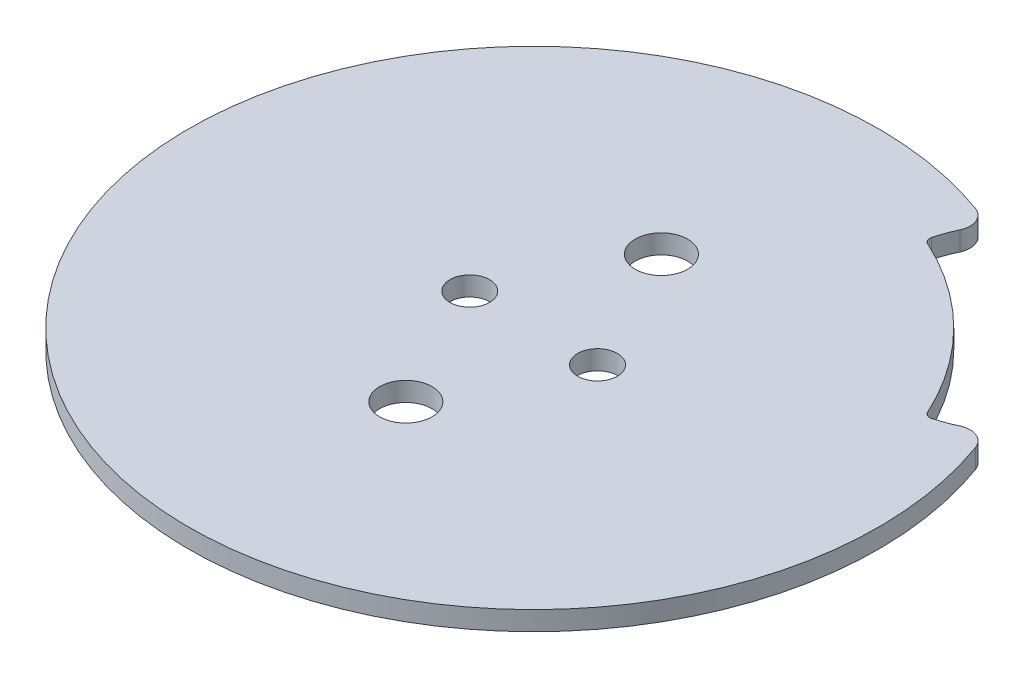
ISO-10303-21;
HEADER;
FILE_DESCRIPTION(('STEP AP214'),'2;1');
FILE_NAME('part.step','',(''),(''),'','','');
FILE_SCHEMA(('AUTOMOTIVE_DESIGN { 1 0 10303 214 1 1 1 1 }'));
ENDSEC;
DATA;
#1=APPLICATION_CONTEXT('core data for automotive mechanical design processes');
#2=APPLICATION_PROTOCOL_DEFINITION('international standard','automotive_design',2000,#1);
#3=PRODUCT_CONTEXT('',#1,'mechanical');
#4=PRODUCT('Part','Part','',(#3));
#5=PRODUCT_RELATED_PRODUCT_CATEGORY('part','',(#4));
#6=PRODUCT_DEFINITION_FORMATION('','',#4);
#7=PRODUCT_DEFINITION_CONTEXT('part definition',#1,'design');
#8=PRODUCT_DEFINITION('design','',#6,#7);
#9=PRODUCT_DEFINITION_SHAPE('','',#8);
#10=(LENGTH_UNIT() NAMED_UNIT(*) SI_UNIT(.MILLI.,.METRE.));
#11=(NAMED_UNIT(*) PLANE_ANGLE_UNIT() SI_UNIT($,.RADIAN.));
#12=(NAMED_UNIT(*) SI_UNIT($,.STERADIAN.) SOLID_ANGLE_UNIT());
#13=UNCERTAINTY_MEASURE_WITH_UNIT(LENGTH_MEASURE(1.E-05),#10,'distance_accuracy_value','');
#14=(GEOMETRIC_REPRESENTATION_CONTEXT(3) GLOBAL_UNCERTAINTY_ASSIGNED_CONTEXT((#13)) GLOBAL_UNIT_ASSIGNED_CONTEXT((#10,
#11,#12)) REPRESENTATION_CONTEXT('',''));
#15=CARTESIAN_POINT('',(0.,0.,0.));
#16=DIRECTION('',(0.,0.,1.));
#17=DIRECTION('',(1.,0.,0.));
#18=AXIS2_PLACEMENT_3D('',#15,#16,#17);
#19=CARTESIAN_POINT('',(38.1837661840735,3.,-38.1837661840737));
#20=DIRECTION('',(0.,-1.,0.));
#21=DIRECTION('',(0.,0.,-1.));
#22=AXIS2_PLACEMENT_3D('',#19,#20,#21);
#23=CYLINDRICAL_SURFACE('',#22,20.);
#24=CARTESIAN_POINT('',(38.1837661840735,0.,-38.1837661840737));
#25=DIRECTION('',(0.,1.,0.));
#26=DIRECTION('',(0.,0.,1.));
#27=AXIS2_PLACEMENT_3D('',#24,#25,#26);
#28=CIRCLE('',#27,20.);
#29=CARTESIAN_POINT('',(43.417148207862,0.,-18.8806132656231));
#30=VERTEX_POINT('',#29);
#31=CARTESIAN_POINT('',(46.6794046105511,0.,-20.0778520197306));
#32=VERTEX_POINT('',#31);
#33=EDGE_CURVE('E105',#30,#32,#28,.T.);
#34=ORIENTED_EDGE('',*,*,#33,.F.);
#35=DIRECTION('',(0.,-1.,0.));
#36=VECTOR('',#35,1.);
#37=CARTESIAN_POINT('',(43.417148207862,3.,-18.8806132656231));
#38=LINE('',#37,#36);
#39=CARTESIAN_POINT('',(43.417148207862,3.,-18.8806132656231));
#40=VERTEX_POINT('',#39);
#41=EDGE_CURVE('E157',#30,#40,#38,.F.);
#42=ORIENTED_EDGE('',*,*,#41,.T.);
#43=CARTESIAN_POINT('',(38.1837661840735,3.,-38.1837661840737));
#44=DIRECTION('',(0.,1.,0.));
#45=DIRECTION('',(0.,0.,1.));
#46=AXIS2_PLACEMENT_3D('',#43,#44,#45);
#47=CIRCLE('',#46,20.);
#48=CARTESIAN_POINT('',(46.6794046105511,3.,-20.0778520197306));
#49=VERTEX_POINT('',#48);
#50=EDGE_CURVE('E131',#40,#49,#47,.T.);
#51=ORIENTED_EDGE('',*,*,#50,.T.);
#52=DIRECTION('',(0.,-1.,0.));
#53=VECTOR('',#52,1.);
#54=CARTESIAN_POINT('',(46.6794046105511,3.,-20.0778520197306));
#55=LINE('',#54,#53);
#56=EDGE_CURVE('E125',#49,#32,#55,.T.);
#57=ORIENTED_EDGE('',*,*,#56,.T.);
#58=EDGE_LOOP('',(#34,#42,#51,#57));
#59=FACE_BOUND('',#58,.T.);
#60=ADVANCED_FACE('F41',(#59),#23,.F.);
#61=CARTESIAN_POINT('',(0.,3.,0.));
#62=DIRECTION('',(0.,-1.,0.));
#63=DIRECTION('',(0.,0.,-1.));
#64=AXIS2_PLACEMENT_3D('',#61,#62,#63);
#65=CYLINDRICAL_SURFACE('',#64,46.5);
#66=CARTESIAN_POINT('',(0.,3.,0.));
#67=DIRECTION('',(0.,1.,0.));
#68=DIRECTION('',(0.,0.,1.));
#69=AXIS2_PLACEMENT_3D('',#66,#67,#68);
#70=CIRCLE('',#69,46.5);
#71=CARTESIAN_POINT('',(42.2469427044268,3.,-19.4279652081447));
#72=VERTEX_POINT('',#71);
#73=CARTESIAN_POINT('',(19.4279652081445,3.,-42.2469427044269));
#74=VERTEX_POINT('',#73);
#75=EDGE_CURVE('E177',#72,#74,#70,.T.);
#76=ORIENTED_EDGE('',*,*,#75,.F.);
#77=DIRECTION('',(0.,-1.,0.));
#78=VECTOR('',#77,1.);
#79=CARTESIAN_POINT('',(42.2469427044268,3.,-19.4279652081447));
#80=LINE('',#79,#78);
#81=CARTESIAN_POINT('',(42.2469427044268,0.,-19.4279652081447));
#82=VERTEX_POINT('',#81);
#83=EDGE_CURVE('E154',#72,#82,#80,.T.);
#84=ORIENTED_EDGE('',*,*,#83,.T.);
#85=CARTESIAN_POINT('',(0.,0.,0.));
#86=DIRECTION('',(0.,1.,0.));
#87=DIRECTION('',(0.,0.,1.));
#88=AXIS2_PLACEMENT_3D('',#85,#86,#87);
#89=CIRCLE('',#88,46.5);
#90=CARTESIAN_POINT('',(19.4279652081445,0.,-42.2469427044269));
#91=VERTEX_POINT('',#90);
#92=EDGE_CURVE('E117',#82,#91,#89,.T.);
#93=ORIENTED_EDGE('',*,*,#92,.T.);
#94=DIRECTION('',(0.,-1.,0.));
#95=VECTOR('',#94,1.);
#96=CARTESIAN_POINT('',(19.4279652081445,3.,-42.2469427044269));
#97=LINE('',#96,#95);
#98=EDGE_CURVE('E152',#91,#74,#97,.F.);
#99=ORIENTED_EDGE('',*,*,#98,.T.);
#100=EDGE_LOOP('',(#76,#84,#93,#99));
#101=FACE_BOUND('',#100,.T.);
#102=ADVANCED_FACE('F168',(#101),#65,.T.);
#103=CARTESIAN_POINT('',(20.0778520197304,3.,-46.6794046105512));
#104=VERTEX_POINT('',#103);
#105=CARTESIAN_POINT('',(18.8806132656229,3.,-43.4171482078621));
#106=VERTEX_POINT('',#105);
#107=EDGE_CURVE('E174',#104,#106,#47,.T.);
#108=ORIENTED_EDGE('',*,*,#107,.T.);
#109=DIRECTION('',(0.,-1.,0.));
#110=VECTOR('',#109,1.);
#111=CARTESIAN_POINT('',(18.8806132656229,3.,-43.4171482078621));
#112=LINE('',#111,#110);
#113=CARTESIAN_POINT('',(18.8806132656229,0.,-43.4171482078621));
#114=VERTEX_POINT('',#113);
#115=EDGE_CURVE('E159',#106,#114,#112,.T.);
#116=ORIENTED_EDGE('',*,*,#115,.T.);
#117=CARTESIAN_POINT('',(20.0778520197304,0.,-46.6794046105512));
#118=VERTEX_POINT('',#117);
#119=EDGE_CURVE('E119',#118,#114,#28,.T.);
#120=ORIENTED_EDGE('',*,*,#119,.F.);
#121=DIRECTION('',(0.,-1.,0.));
#122=VECTOR('',#121,1.);
#123=CARTESIAN_POINT('',(20.0778520197304,3.,-46.6794046105512));
#124=LINE('',#123,#122);
#125=EDGE_CURVE('E150',#118,#104,#124,.F.);
#126=ORIENTED_EDGE('',*,*,#125,.T.);
#127=EDGE_LOOP('',(#108,#116,#120,#126));
#128=FACE_BOUND('',#127,.T.);
#129=ADVANCED_FACE('F172',(#128),#23,.F.);
#130=CARTESIAN_POINT('',(0.,3.,20.));
#131=DIRECTION('',(0.,-1.,0.));
#132=DIRECTION('',(0.,0.,-1.));
#133=AXIS2_PLACEMENT_3D('',#130,#131,#132);
#134=CYLINDRICAL_SURFACE('',#133,4.1);
#135=CARTESIAN_POINT('',(0.,3.,20.));
#136=DIRECTION('',(0.,1.,0.));
#137=DIRECTION('',(0.,0.,1.));
#138=AXIS2_PLACEMENT_3D('',#135,#136,#137);
#139=CIRCLE('',#138,4.1);
#140=CARTESIAN_POINT('',(0.,3.,24.1));
#141=VERTEX_POINT('',#140);
#142=EDGE_CURVE('E137',#141,#141,#139,.T.);
#143=ORIENTED_EDGE('',*,*,#142,.T.);
#144=EDGE_LOOP('',(#143));
#145=FACE_BOUND('',#144,.T.);
#146=CARTESIAN_POINT('',(0.,0.,20.));
#147=DIRECTION('',(0.,1.,0.));
#148=DIRECTION('',(0.,0.,1.));
#149=AXIS2_PLACEMENT_3D('',#146,#147,#148);
#150=CIRCLE('',#149,4.1);
#151=CARTESIAN_POINT('',(0.,0.,24.1));
#152=VERTEX_POINT('',#151);
#153=EDGE_CURVE('E184',#152,#152,#150,.T.);
#154=ORIENTED_EDGE('',*,*,#153,.F.);
#155=EDGE_LOOP('',(#154));
#156=FACE_BOUND('',#155,.T.);
#157=ADVANCED_FACE('F241',(#145,#156),#134,.F.);
#158=CARTESIAN_POINT('',(-10.,3.,0.));
#159=DIRECTION('',(0.,-1.,0.));
#160=DIRECTION('',(0.,0.,-1.));
#161=AXIS2_PLACEMENT_3D('',#158,#159,#160);
#162=CYLINDRICAL_SURFACE('',#161,3.1);
#163=CARTESIAN_POINT('',(-10.,3.,0.));
#164=DIRECTION('',(0.,1.,0.));
#165=DIRECTION('',(0.,0.,1.));
#166=AXIS2_PLACEMENT_3D('',#163,#164,#165);
#167=CIRCLE('',#166,3.1);
#168=CARTESIAN_POINT('',(-10.,3.,3.1));
#169=VERTEX_POINT('',#168);
#170=EDGE_CURVE('E201',#169,#169,#167,.T.);
#171=ORIENTED_EDGE('',*,*,#170,.T.);
#172=EDGE_LOOP('',(#171));
#173=FACE_BOUND('',#172,.T.);
#174=CARTESIAN_POINT('',(-10.,0.,0.));
#175=DIRECTION('',(0.,1.,0.));
#176=DIRECTION('',(0.,0.,1.));
#177=AXIS2_PLACEMENT_3D('',#174,#175,#176);
#178=CIRCLE('',#177,3.1);
#179=CARTESIAN_POINT('',(-10.,0.,3.1));
#180=VERTEX_POINT('',#179);
#181=EDGE_CURVE('E188',#180,#180,#178,.T.);
#182=ORIENTED_EDGE('',*,*,#181,.F.);
#183=EDGE_LOOP('',(#182));
#184=FACE_BOUND('',#183,.T.);
#185=ADVANCED_FACE('F245',(#173,#184),#162,.F.);
#186=CARTESIAN_POINT('',(10.,3.,0.));
#187=DIRECTION('',(0.,-1.,0.));
#188=DIRECTION('',(0.,0.,-1.));
#189=AXIS2_PLACEMENT_3D('',#186,#187,#188);
#190=CYLINDRICAL_SURFACE('',#189,3.1);
#191=CARTESIAN_POINT('',(10.,3.,0.));
#192=DIRECTION('',(0.,1.,0.));
#193=DIRECTION('',(0.,0.,1.));
#194=AXIS2_PLACEMENT_3D('',#191,#192,#193);
#195=CIRCLE('',#194,3.1);
#196=CARTESIAN_POINT('',(10.,3.,3.1));
#197=VERTEX_POINT('',#196);
#198=EDGE_CURVE('E180',#197,#197,#195,.T.);
#199=ORIENTED_EDGE('',*,*,#198,.T.);
#200=EDGE_LOOP('',(#199));
#201=FACE_BOUND('',#200,.T.);
#202=CARTESIAN_POINT('',(10.,0.,0.));
#203=DIRECTION('',(0.,1.,0.));
#204=DIRECTION('',(0.,0.,1.));
#205=AXIS2_PLACEMENT_3D('',#202,#203,#204);
#206=CIRCLE('',#205,3.1);
#207=CARTESIAN_POINT('',(10.,0.,3.1));
#208=VERTEX_POINT('',#207);
#209=EDGE_CURVE('E192',#208,#208,#206,.T.);
#210=ORIENTED_EDGE('',*,*,#209,.F.);
#211=EDGE_LOOP('',(#210));
#212=FACE_BOUND('',#211,.T.);
#213=ADVANCED_FACE('F207',(#201,#212),#190,.F.);
#214=CARTESIAN_POINT('',(0.,3.,0.));
#215=DIRECTION('',(0.,-1.,0.));
#216=DIRECTION('',(0.,0.,-1.));
#217=AXIS2_PLACEMENT_3D('',#214,#215,#216);
#218=CYLINDRICAL_SURFACE('',#217,54.);
#219=CARTESIAN_POINT('',(0.,0.,0.));
#220=DIRECTION('',(0.,1.,0.));
#221=DIRECTION('',(0.,0.,1.));
#222=AXIS2_PLACEMENT_3D('',#219,#220,#221);
#223=CIRCLE('',#222,54.);
#224=CARTESIAN_POINT('',(18.3832569477307,0.,-50.774559220083));
#225=VERTEX_POINT('',#224);
#226=CARTESIAN_POINT('',(50.7745592200829,0.,-18.3832569477309));
#227=VERTEX_POINT('',#226);
#228=EDGE_CURVE('E197',#225,#227,#223,.T.);
#229=ORIENTED_EDGE('',*,*,#228,.T.);
#230=DIRECTION('',(0.,-1.,0.));
#231=VECTOR('',#230,1.);
#232=CARTESIAN_POINT('',(50.7745592200829,3.,-18.3832569477309));
#233=LINE('',#232,#231);
#234=CARTESIAN_POINT('',(50.7745592200829,3.,-18.3832569477309));
#235=VERTEX_POINT('',#234);
#236=EDGE_CURVE('E126',#227,#235,#233,.F.);
#237=ORIENTED_EDGE('',*,*,#236,.T.);
#238=CARTESIAN_POINT('',(0.,3.,0.));
#239=DIRECTION('',(0.,1.,0.));
#240=DIRECTION('',(0.,0.,1.));
#241=AXIS2_PLACEMENT_3D('',#238,#239,#240);
#242=CIRCLE('',#241,54.);
#243=CARTESIAN_POINT('',(18.3832569477307,3.,-50.774559220083));
#244=VERTEX_POINT('',#243);
#245=EDGE_CURVE('E176',#244,#235,#242,.T.);
#246=ORIENTED_EDGE('',*,*,#245,.F.);
#247=DIRECTION('',(0.,-1.,0.));
#248=VECTOR('',#247,1.);
#249=CARTESIAN_POINT('',(18.3832569477307,3.,-50.774559220083));
#250=LINE('',#249,#248);
#251=EDGE_CURVE('E127',#244,#225,#250,.T.);
#252=ORIENTED_EDGE('',*,*,#251,.T.);
#253=EDGE_LOOP('',(#229,#237,#246,#252));
#254=FACE_BOUND('',#253,.T.);
#255=ADVANCED_FACE('F223',(#254),#218,.T.);
#256=CARTESIAN_POINT('',(0.,3.,-20.));
#257=DIRECTION('',(0.,-1.,0.));
#258=DIRECTION('',(0.,0.,-1.));
#259=AXIS2_PLACEMENT_3D('',#256,#257,#258);
#260=CYLINDRICAL_SURFACE('',#259,4.1);
#261=CARTESIAN_POINT('',(0.,3.,-20.));
#262=DIRECTION('',(0.,1.,0.));
#263=DIRECTION('',(0.,0.,1.));
#264=AXIS2_PLACEMENT_3D('',#261,#262,#263);
#265=CIRCLE('',#264,4.1);
#266=CARTESIAN_POINT('',(0.,3.,-15.9));
#267=VERTEX_POINT('',#266);
#268=EDGE_CURVE('E133',#267,#267,#265,.T.);
#269=ORIENTED_EDGE('',*,*,#268,.T.);
#270=EDGE_LOOP('',(#269));
#271=FACE_BOUND('',#270,.T.);
#272=CARTESIAN_POINT('',(0.,0.,-20.));
#273=DIRECTION('',(0.,1.,0.));
#274=DIRECTION('',(0.,0.,1.));
#275=AXIS2_PLACEMENT_3D('',#272,#273,#274);
#276=CIRCLE('',#275,4.1);
#277=CARTESIAN_POINT('',(0.,0.,-15.9));
#278=VERTEX_POINT('',#277);
#279=EDGE_CURVE('E140',#278,#278,#276,.T.);
#280=ORIENTED_EDGE('',*,*,#279,.F.);
#281=EDGE_LOOP('',(#280));
#282=FACE_BOUND('',#281,.T.);
#283=ADVANCED_FACE('F213',(#271,#282),#260,.F.);
#284=CARTESIAN_POINT('',(0.,3.,0.));
#285=DIRECTION('',(0.,1.,0.));
#286=DIRECTION('',(0.,0.,1.));
#287=AXIS2_PLACEMENT_3D('',#284,#285,#286);
#288=PLANE('',#287);
#289=ORIENTED_EDGE('',*,*,#245,.T.);
#290=CARTESIAN_POINT('',(47.9537503745227,3.,-17.3619648950792));
#291=DIRECTION('',(0.,1.,0.));
#292=DIRECTION('',(0.,0.,1.));
#293=AXIS2_PLACEMENT_3D('',#290,#291,#292);
#294=CIRCLE('',#293,3.);
#295=EDGE_CURVE('E148',#235,#49,#294,.T.);
#296=ORIENTED_EDGE('',*,*,#295,.T.);
#297=ORIENTED_EDGE('',*,*,#50,.F.);
#298=CARTESIAN_POINT('',(43.1554791066725,3.,-19.8457709115456));
#299=DIRECTION('',(0.,1.,0.));
#300=DIRECTION('',(0.,0.,1.));
#301=AXIS2_PLACEMENT_3D('',#298,#299,#300);
#302=CIRCLE('',#301,1.);
#303=EDGE_CURVE('E162',#40,#72,#302,.F.);
#304=ORIENTED_EDGE('',*,*,#303,.T.);
#305=ORIENTED_EDGE('',*,*,#75,.T.);
#306=CARTESIAN_POINT('',(19.8457709115454,3.,-43.1554791066726));
#307=DIRECTION('',(0.,1.,0.));
#308=DIRECTION('',(0.,0.,1.));
#309=AXIS2_PLACEMENT_3D('',#306,#307,#308);
#310=CIRCLE('',#309,1.);
#311=EDGE_CURVE('E11',#74,#106,#310,.F.);
#312=ORIENTED_EDGE('',*,*,#311,.T.);
#313=ORIENTED_EDGE('',*,*,#107,.F.);
#314=CARTESIAN_POINT('',(17.361964895079,3.,-47.9537503745228));
#315=DIRECTION('',(0.,1.,0.));
#316=DIRECTION('',(0.,0.,1.));
#317=AXIS2_PLACEMENT_3D('',#314,#315,#316);
#318=CIRCLE('',#317,3.);
#319=EDGE_CURVE('E146',#104,#244,#318,.T.);
#320=ORIENTED_EDGE('',*,*,#319,.T.);
#321=EDGE_LOOP('',(#289,#296,#297,#304,#305,#312,#313,#320));
#322=FACE_BOUND('',#321,.T.);
#323=ORIENTED_EDGE('',*,*,#198,.F.);
#324=EDGE_LOOP('',(#323));
#325=FACE_BOUND('',#324,.T.);
#326=ORIENTED_EDGE('',*,*,#170,.F.);
#327=EDGE_LOOP('',(#326));
#328=FACE_BOUND('',#327,.T.);
#329=ORIENTED_EDGE('',*,*,#142,.F.);
#330=EDGE_LOOP('',(#329));
#331=FACE_BOUND('',#330,.T.);
#332=ORIENTED_EDGE('',*,*,#268,.F.);
#333=EDGE_LOOP('',(#332));
#334=FACE_BOUND('',#333,.T.);
#335=ADVANCED_FACE('F210',(#322,#325,#328,#331,#334),#288,.T.);
#336=CARTESIAN_POINT('',(0.,0.,0.));
#337=DIRECTION('',(0.,1.,0.));
#338=DIRECTION('',(0.,0.,1.));
#339=AXIS2_PLACEMENT_3D('',#336,#337,#338);
#340=PLANE('',#339);
#341=ORIENTED_EDGE('',*,*,#92,.F.);
#342=CARTESIAN_POINT('',(43.1554791066725,0.,-19.8457709115456));
#343=DIRECTION('',(0.,1.,0.));
#344=DIRECTION('',(0.,0.,1.));
#345=AXIS2_PLACEMENT_3D('',#342,#343,#344);
#346=CIRCLE('',#345,1.);
#347=EDGE_CURVE('E113',#82,#30,#346,.T.);
#348=ORIENTED_EDGE('',*,*,#347,.T.);
#349=ORIENTED_EDGE('',*,*,#33,.T.);
#350=CARTESIAN_POINT('',(47.9537503745227,0.,-17.3619648950792));
#351=DIRECTION('',(0.,1.,0.));
#352=DIRECTION('',(0.,0.,1.));
#353=AXIS2_PLACEMENT_3D('',#350,#351,#352);
#354=CIRCLE('',#353,3.);
#355=EDGE_CURVE('E111',#32,#227,#354,.F.);
#356=ORIENTED_EDGE('',*,*,#355,.T.);
#357=ORIENTED_EDGE('',*,*,#228,.F.);
#358=CARTESIAN_POINT('',(17.361964895079,0.,-47.9537503745228));
#359=DIRECTION('',(0.,1.,0.));
#360=DIRECTION('',(0.,0.,1.));
#361=AXIS2_PLACEMENT_3D('',#358,#359,#360);
#362=CIRCLE('',#361,3.);
#363=EDGE_CURVE('E128',#225,#118,#362,.F.);
#364=ORIENTED_EDGE('',*,*,#363,.T.);
#365=ORIENTED_EDGE('',*,*,#119,.T.);
#366=CARTESIAN_POINT('',(19.8457709115454,0.,-43.1554791066726));
#367=DIRECTION('',(0.,1.,0.));
#368=DIRECTION('',(0.,0.,1.));
#369=AXIS2_PLACEMENT_3D('',#366,#367,#368);
#370=CIRCLE('',#369,1.);
#371=EDGE_CURVE('E49',#114,#91,#370,.T.);
#372=ORIENTED_EDGE('',*,*,#371,.T.);
#373=EDGE_LOOP('',(#341,#348,#349,#356,#357,#364,#365,#372));
#374=FACE_BOUND('',#373,.T.);
#375=ORIENTED_EDGE('',*,*,#209,.T.);
#376=EDGE_LOOP('',(#375));
#377=FACE_BOUND('',#376,.T.);
#378=ORIENTED_EDGE('',*,*,#181,.T.);
#379=EDGE_LOOP('',(#378));
#380=FACE_BOUND('',#379,.T.);
#381=ORIENTED_EDGE('',*,*,#153,.T.);
#382=EDGE_LOOP('',(#381));
#383=FACE_BOUND('',#382,.T.);
#384=ORIENTED_EDGE('',*,*,#279,.T.);
#385=EDGE_LOOP('',(#384));
#386=FACE_BOUND('',#385,.T.);
#387=ADVANCED_FACE('F108',(#374,#377,#380,#383,#386),#340,.F.);
#388=CARTESIAN_POINT('',(47.9537503745227,3.,-17.3619648950792));
#389=DIRECTION('',(0.,1.,0.));
#390=DIRECTION('',(0.,0.,1.));
#391=AXIS2_PLACEMENT_3D('',#388,#389,#390);
#392=CYLINDRICAL_SURFACE('',#391,3.);
#393=ORIENTED_EDGE('',*,*,#295,.F.);
#394=ORIENTED_EDGE('',*,*,#236,.F.);
#395=ORIENTED_EDGE('',*,*,#355,.F.);
#396=ORIENTED_EDGE('',*,*,#56,.F.);
#397=EDGE_LOOP('',(#393,#394,#395,#396));
#398=FACE_BOUND('',#397,.T.);
#399=ADVANCED_FACE('F124',(#398),#392,.T.);
#400=CARTESIAN_POINT('',(17.361964895079,3.,-47.9537503745228));
#401=DIRECTION('',(0.,1.,0.));
#402=DIRECTION('',(0.,0.,1.));
#403=AXIS2_PLACEMENT_3D('',#400,#401,#402);
#404=CYLINDRICAL_SURFACE('',#403,3.);
#405=ORIENTED_EDGE('',*,*,#319,.F.);
#406=ORIENTED_EDGE('',*,*,#125,.F.);
#407=ORIENTED_EDGE('',*,*,#363,.F.);
#408=ORIENTED_EDGE('',*,*,#251,.F.);
#409=EDGE_LOOP('',(#405,#406,#407,#408));
#410=FACE_BOUND('',#409,.T.);
#411=ADVANCED_FACE('F312',(#410),#404,.T.);
#412=CARTESIAN_POINT('',(43.1554791066725,3.,-19.8457709115456));
#413=DIRECTION('',(0.,-1.,0.));
#414=DIRECTION('',(0.,0.,-1.));
#415=AXIS2_PLACEMENT_3D('',#412,#413,#414);
#416=CYLINDRICAL_SURFACE('',#415,1.);
#417=ORIENTED_EDGE('',*,*,#303,.F.);
#418=ORIENTED_EDGE('',*,*,#41,.F.);
#419=ORIENTED_EDGE('',*,*,#347,.F.);
#420=ORIENTED_EDGE('',*,*,#83,.F.);
#421=EDGE_LOOP('',(#417,#418,#419,#420));
#422=FACE_BOUND('',#421,.T.);
#423=ADVANCED_FACE('F320',(#422),#416,.F.);
#424=CARTESIAN_POINT('',(19.8457709115454,3.,-43.1554791066726));
#425=DIRECTION('',(0.,-1.,0.));
#426=DIRECTION('',(0.,0.,-1.));
#427=AXIS2_PLACEMENT_3D('',#424,#425,#426);
#428=CYLINDRICAL_SURFACE('',#427,1.);
#429=ORIENTED_EDGE('',*,*,#311,.F.);
#430=ORIENTED_EDGE('',*,*,#98,.F.);
#431=ORIENTED_EDGE('',*,*,#371,.F.);
#432=ORIENTED_EDGE('',*,*,#115,.F.);
#433=EDGE_LOOP('',(#429,#430,#431,#432));
#434=FACE_BOUND('',#433,.T.);
#435=ADVANCED_FACE('F43',(#434),#428,.F.);
#436=CLOSED_SHELL('',(#60,#102,#129,#157,#185,#213,#255,#283,#335,#387,#399,#411,#423,#435));
#437=MANIFOLD_SOLID_BREP('B2',#436);
#438=ADVANCED_BREP_SHAPE_REPRESENTATION('',(#18,#437),#14);
#439=SHAPE_DEFINITION_REPRESENTATION(#9,#438);
ENDSEC;
END-ISO-10303-21;
